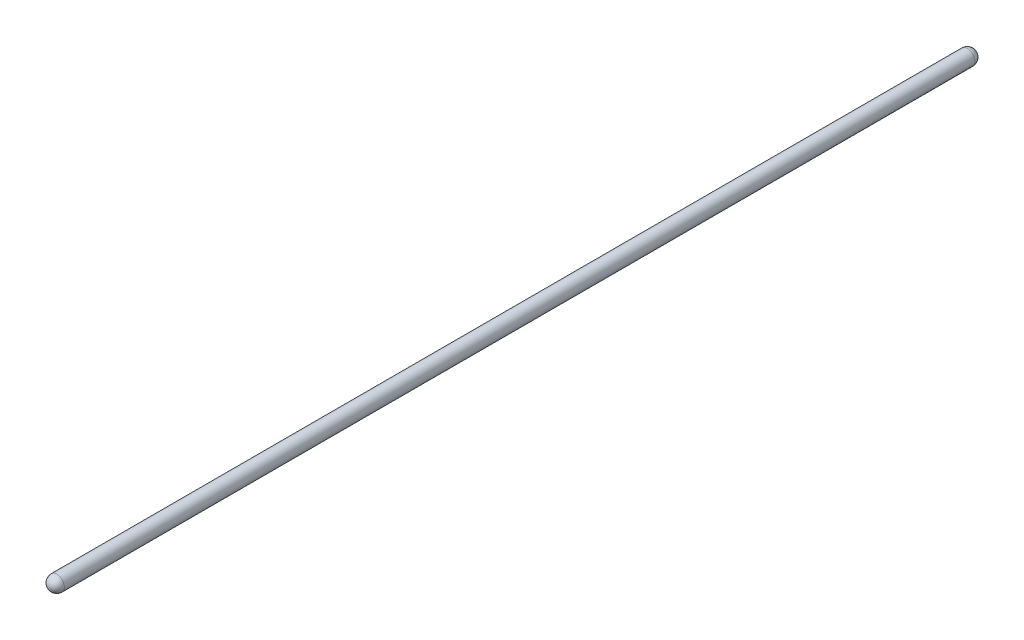
ISO-10303-21;
HEADER;
FILE_DESCRIPTION(('STEP AP214'),'2;1');
FILE_NAME('part.step','',(''),(''),'','','');
FILE_SCHEMA(('AUTOMOTIVE_DESIGN { 1 0 10303 214 1 1 1 1 }'));
ENDSEC;
DATA;
#1=APPLICATION_CONTEXT('core data for automotive mechanical design processes');
#2=APPLICATION_PROTOCOL_DEFINITION('international standard','automotive_design',2000,#1);
#3=PRODUCT_CONTEXT('',#1,'mechanical');
#4=PRODUCT('Part','Part','',(#3));
#5=PRODUCT_RELATED_PRODUCT_CATEGORY('part','',(#4));
#6=PRODUCT_DEFINITION_FORMATION('','',#4);
#7=PRODUCT_DEFINITION_CONTEXT('part definition',#1,'design');
#8=PRODUCT_DEFINITION('design','',#6,#7);
#9=PRODUCT_DEFINITION_SHAPE('','',#8);
#10=(LENGTH_UNIT() NAMED_UNIT(*) SI_UNIT(.MILLI.,.METRE.));
#11=(NAMED_UNIT(*) PLANE_ANGLE_UNIT() SI_UNIT($,.RADIAN.));
#12=(NAMED_UNIT(*) SI_UNIT($,.STERADIAN.) SOLID_ANGLE_UNIT());
#13=UNCERTAINTY_MEASURE_WITH_UNIT(LENGTH_MEASURE(1.E-05),#10,'distance_accuracy_value','');
#14=(GEOMETRIC_REPRESENTATION_CONTEXT(3) GLOBAL_UNCERTAINTY_ASSIGNED_CONTEXT((#13)) GLOBAL_UNIT_ASSIGNED_CONTEXT((#10,
#11,#12)) REPRESENTATION_CONTEXT('',''));
#15=CARTESIAN_POINT('',(0.,0.,0.));
#16=DIRECTION('',(0.,0.,1.));
#17=DIRECTION('',(1.,0.,0.));
#18=AXIS2_PLACEMENT_3D('',#15,#16,#17);
#19=CARTESIAN_POINT('',(0.,0.,60.));
#20=DIRECTION('',(0.,0.,-1.));
#21=DIRECTION('',(-1.,0.,0.));
#22=AXIS2_PLACEMENT_3D('',#19,#20,#21);
#23=CYLINDRICAL_SURFACE('',#22,0.5);
#24=CARTESIAN_POINT('',(0.,0.,60.));
#25=DIRECTION('',(0.,0.,1.));
#26=DIRECTION('',(1.,0.,0.));
#27=AXIS2_PLACEMENT_3D('',#24,#25,#26);
#28=CIRCLE('',#27,0.5);
#29=CARTESIAN_POINT('',(0.5,0.,60.));
#30=VERTEX_POINT('',#29);
#31=EDGE_CURVE('E10',#30,#30,#28,.T.);
#32=ORIENTED_EDGE('',*,*,#31,.F.);
#33=EDGE_LOOP('',(#32));
#34=FACE_BOUND('',#33,.T.);
#35=CARTESIAN_POINT('',(0.,0.,0.));
#36=DIRECTION('',(0.,0.,-1.));
#37=DIRECTION('',(-1.,0.,0.));
#38=AXIS2_PLACEMENT_3D('',#35,#36,#37);
#39=CIRCLE('',#38,0.5);
#40=CARTESIAN_POINT('',(-0.5,0.,0.));
#41=VERTEX_POINT('',#40);
#42=EDGE_CURVE('E38',#41,#41,#39,.T.);
#43=ORIENTED_EDGE('',*,*,#42,.F.);
#44=EDGE_LOOP('',(#43));
#45=FACE_BOUND('',#44,.T.);
#46=ADVANCED_FACE('F32',(#34,#45),#23,.T.);
#47=CARTESIAN_POINT('',(0.,0.,60.));
#48=DIRECTION('',(0.,0.,1.));
#49=DIRECTION('',(-1.,0.,0.));
#50=AXIS2_PLACEMENT_3D('',#47,#48,#49);
#51=SPHERICAL_SURFACE('',#50,0.5);
#52=ORIENTED_EDGE('',*,*,#31,.T.);
#53=EDGE_LOOP('',(#52));
#54=FACE_BOUND('',#53,.T.);
#55=ADVANCED_FACE('F47',(#54),#51,.T.);
#56=CARTESIAN_POINT('',(0.,0.,0.));
#57=DIRECTION('',(0.,0.,-1.));
#58=DIRECTION('',(1.,0.,0.));
#59=AXIS2_PLACEMENT_3D('',#56,#57,#58);
#60=SPHERICAL_SURFACE('',#59,0.5);
#61=ORIENTED_EDGE('',*,*,#42,.T.);
#62=EDGE_LOOP('',(#61));
#63=FACE_BOUND('',#62,.T.);
#64=ADVANCED_FACE('F44',(#63),#60,.T.);
#65=CLOSED_SHELL('',(#46,#55,#64));
#66=MANIFOLD_SOLID_BREP('B2',#65);
#67=ADVANCED_BREP_SHAPE_REPRESENTATION('',(#18,#66),#14);
#68=SHAPE_DEFINITION_REPRESENTATION(#9,#67);
ENDSEC;
END-ISO-10303-21;
